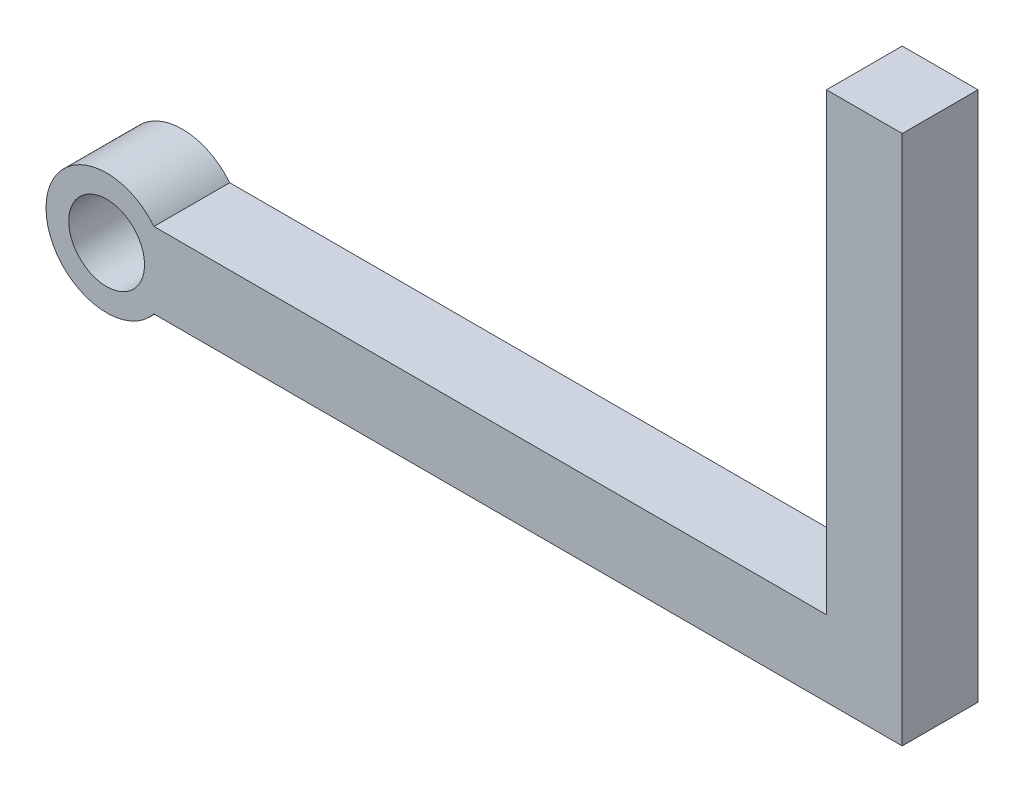
ISO-10303-21;
HEADER;
FILE_DESCRIPTION(('STEP AP214'),'2;1');
FILE_NAME('part.step','',(''),(''),'','','');
FILE_SCHEMA(('AUTOMOTIVE_DESIGN { 1 0 10303 214 1 1 1 1 }'));
ENDSEC;
DATA;
#1=APPLICATION_CONTEXT('core data for automotive mechanical design processes');
#2=APPLICATION_PROTOCOL_DEFINITION('international standard','automotive_design',2000,#1);
#3=PRODUCT_CONTEXT('',#1,'mechanical');
#4=PRODUCT('Part','Part','',(#3));
#5=PRODUCT_RELATED_PRODUCT_CATEGORY('part','',(#4));
#6=PRODUCT_DEFINITION_FORMATION('','',#4);
#7=PRODUCT_DEFINITION_CONTEXT('part definition',#1,'design');
#8=PRODUCT_DEFINITION('design','',#6,#7);
#9=PRODUCT_DEFINITION_SHAPE('','',#8);
#10=(LENGTH_UNIT() NAMED_UNIT(*) SI_UNIT(.MILLI.,.METRE.));
#11=(NAMED_UNIT(*) PLANE_ANGLE_UNIT() SI_UNIT($,.RADIAN.));
#12=(NAMED_UNIT(*) SI_UNIT($,.STERADIAN.) SOLID_ANGLE_UNIT());
#13=UNCERTAINTY_MEASURE_WITH_UNIT(LENGTH_MEASURE(1.E-05),#10,'distance_accuracy_value','');
#14=(GEOMETRIC_REPRESENTATION_CONTEXT(3) GLOBAL_UNCERTAINTY_ASSIGNED_CONTEXT((#13)) GLOBAL_UNIT_ASSIGNED_CONTEXT((#10,
#11,#12)) REPRESENTATION_CONTEXT('',''));
#15=CARTESIAN_POINT('',(0.,0.,0.));
#16=DIRECTION('',(0.,0.,1.));
#17=DIRECTION('',(1.,0.,0.));
#18=AXIS2_PLACEMENT_3D('',#15,#16,#17);
#19=CARTESIAN_POINT('',(0.,12.7,-31.75));
#20=DIRECTION('',(0.,0.,-1.));
#21=DIRECTION('',(-1.,0.,0.));
#22=AXIS2_PLACEMENT_3D('',#19,#20,#21);
#23=PLANE('',#22);
#24=CARTESIAN_POINT('',(-69.85,6.35,-31.75));
#25=DIRECTION('',(0.,0.,-1.));
#26=DIRECTION('',(-1.,0.,0.));
#27=AXIS2_PLACEMENT_3D('',#24,#25,#26);
#28=CIRCLE('',#27,6.34999999999999);
#29=CARTESIAN_POINT('',(-76.2,6.35,-31.75));
#30=VERTEX_POINT('',#29);
#31=EDGE_CURVE('E103',#30,#30,#28,.T.);
#32=ORIENTED_EDGE('',*,*,#31,.T.);
#33=EDGE_LOOP('',(#32));
#34=FACE_BOUND('',#33,.T.);
#35=DIRECTION('',(1.,0.,0.));
#36=VECTOR('',#35,1.);
#37=CARTESIAN_POINT('',(0.,12.7,-31.75));
#38=LINE('',#37,#36);
#39=CARTESIAN_POINT('',(-61.918852542034,12.7,-31.75));
#40=VERTEX_POINT('',#39);
#41=CARTESIAN_POINT('',(50.8,12.7,-31.75));
#42=VERTEX_POINT('',#41);
#43=EDGE_CURVE('E92',#40,#42,#38,.T.);
#44=ORIENTED_EDGE('',*,*,#43,.F.);
#45=CARTESIAN_POINT('',(-69.85,6.35,-31.75));
#46=DIRECTION('',(0.,0.,-1.));
#47=DIRECTION('',(-1.,0.,0.));
#48=AXIS2_PLACEMENT_3D('',#45,#46,#47);
#49=CIRCLE('',#48,10.16);
#50=CARTESIAN_POINT('',(-61.918852542034,0.,-31.75));
#51=VERTEX_POINT('',#50);
#52=EDGE_CURVE('E102',#51,#40,#49,.T.);
#53=ORIENTED_EDGE('',*,*,#52,.F.);
#54=DIRECTION('',(1.,0.,0.));
#55=VECTOR('',#54,1.);
#56=CARTESIAN_POINT('',(0.,0.,-31.75));
#57=LINE('',#56,#55);
#58=CARTESIAN_POINT('',(63.5,0.,-31.75));
#59=VERTEX_POINT('',#58);
#60=EDGE_CURVE('E97',#51,#59,#57,.T.);
#61=ORIENTED_EDGE('',*,*,#60,.T.);
#62=DIRECTION('',(0.,-1.,0.));
#63=VECTOR('',#62,1.);
#64=CARTESIAN_POINT('',(63.5,12.7,-31.75));
#65=LINE('',#64,#63);
#66=CARTESIAN_POINT('',(63.5,88.9,-31.75));
#67=VERTEX_POINT('',#66);
#68=EDGE_CURVE('E40',#67,#59,#65,.T.);
#69=ORIENTED_EDGE('',*,*,#68,.F.);
#70=DIRECTION('',(1.,0.,0.));
#71=VECTOR('',#70,1.);
#72=CARTESIAN_POINT('',(50.8,88.9,-31.75));
#73=LINE('',#72,#71);
#74=CARTESIAN_POINT('',(50.8,88.9,-31.75));
#75=VERTEX_POINT('',#74);
#76=EDGE_CURVE('E119',#75,#67,#73,.T.);
#77=ORIENTED_EDGE('',*,*,#76,.F.);
#78=DIRECTION('',(0.,-1.,0.));
#79=VECTOR('',#78,1.);
#80=CARTESIAN_POINT('',(50.8,88.9,-31.75));
#81=LINE('',#80,#79);
#82=EDGE_CURVE('E122',#75,#42,#81,.T.);
#83=ORIENTED_EDGE('',*,*,#82,.T.);
#84=EDGE_LOOP('',(#44,#53,#61,#69,#77,#83));
#85=FACE_BOUND('',#84,.T.);
#86=ADVANCED_FACE('F33',(#34,#85),#23,.F.);
#87=CARTESIAN_POINT('',(63.5,12.7,0.));
#88=DIRECTION('',(-1.,0.,0.));
#89=DIRECTION('',(0.,0.,1.));
#90=AXIS2_PLACEMENT_3D('',#87,#88,#89);
#91=PLANE('',#90);
#92=DIRECTION('',(0.,0.,-1.));
#93=VECTOR('',#92,1.);
#94=CARTESIAN_POINT('',(63.5,0.,0.));
#95=LINE('',#94,#93);
#96=CARTESIAN_POINT('',(63.5,0.,-44.45));
#97=VERTEX_POINT('',#96);
#98=EDGE_CURVE('E93',#59,#97,#95,.T.);
#99=ORIENTED_EDGE('',*,*,#98,.T.);
#100=DIRECTION('',(0.,-1.,0.));
#101=VECTOR('',#100,1.);
#102=CARTESIAN_POINT('',(63.5,12.7,-44.45));
#103=LINE('',#102,#101);
#104=CARTESIAN_POINT('',(63.5,88.9,-44.45));
#105=VERTEX_POINT('',#104);
#106=EDGE_CURVE('E88',#105,#97,#103,.T.);
#107=ORIENTED_EDGE('',*,*,#106,.F.);
#108=DIRECTION('',(0.,0.,-1.));
#109=VECTOR('',#108,1.);
#110=CARTESIAN_POINT('',(63.5,88.9,-31.75));
#111=LINE('',#110,#109);
#112=EDGE_CURVE('E112',#67,#105,#111,.T.);
#113=ORIENTED_EDGE('',*,*,#112,.F.);
#114=ORIENTED_EDGE('',*,*,#68,.T.);
#115=EDGE_LOOP('',(#99,#107,#113,#114));
#116=FACE_BOUND('',#115,.T.);
#117=ADVANCED_FACE('F137',(#116),#91,.F.);
#118=CARTESIAN_POINT('',(0.,12.7,-44.45));
#119=DIRECTION('',(0.,0.,-1.));
#120=DIRECTION('',(-1.,0.,0.));
#121=AXIS2_PLACEMENT_3D('',#118,#119,#120);
#122=PLANE('',#121);
#123=CARTESIAN_POINT('',(-69.85,6.35,-44.45));
#124=DIRECTION('',(0.,0.,-1.));
#125=DIRECTION('',(-1.,0.,0.));
#126=AXIS2_PLACEMENT_3D('',#123,#124,#125);
#127=CIRCLE('',#126,6.34999999999999);
#128=CARTESIAN_POINT('',(-76.2,6.35,-44.45));
#129=VERTEX_POINT('',#128);
#130=EDGE_CURVE('E107',#129,#129,#127,.T.);
#131=ORIENTED_EDGE('',*,*,#130,.F.);
#132=EDGE_LOOP('',(#131));
#133=FACE_BOUND('',#132,.T.);
#134=DIRECTION('',(1.,0.,0.));
#135=VECTOR('',#134,1.);
#136=CARTESIAN_POINT('',(0.,0.,-44.45));
#137=LINE('',#136,#135);
#138=CARTESIAN_POINT('',(-61.918852542034,0.,-44.45));
#139=VERTEX_POINT('',#138);
#140=EDGE_CURVE('E83',#139,#97,#137,.T.);
#141=ORIENTED_EDGE('',*,*,#140,.F.);
#142=CARTESIAN_POINT('',(-69.85,6.35,-44.45));
#143=DIRECTION('',(0.,0.,-1.));
#144=DIRECTION('',(-1.,0.,0.));
#145=AXIS2_PLACEMENT_3D('',#142,#143,#144);
#146=CIRCLE('',#145,10.16);
#147=CARTESIAN_POINT('',(-61.918852542034,12.7,-44.45));
#148=VERTEX_POINT('',#147);
#149=EDGE_CURVE('E86',#139,#148,#146,.T.);
#150=ORIENTED_EDGE('',*,*,#149,.T.);
#151=DIRECTION('',(1.,0.,0.));
#152=VECTOR('',#151,1.);
#153=CARTESIAN_POINT('',(0.,12.7,-44.45));
#154=LINE('',#153,#152);
#155=CARTESIAN_POINT('',(50.8,12.7,-44.45));
#156=VERTEX_POINT('',#155);
#157=EDGE_CURVE('E52',#148,#156,#154,.T.);
#158=ORIENTED_EDGE('',*,*,#157,.T.);
#159=DIRECTION('',(0.,-1.,0.));
#160=VECTOR('',#159,1.);
#161=CARTESIAN_POINT('',(50.8,88.9,-44.45));
#162=LINE('',#161,#160);
#163=CARTESIAN_POINT('',(50.8,88.9,-44.45));
#164=VERTEX_POINT('',#163);
#165=EDGE_CURVE('E127',#164,#156,#162,.T.);
#166=ORIENTED_EDGE('',*,*,#165,.F.);
#167=DIRECTION('',(-1.,0.,0.));
#168=VECTOR('',#167,1.);
#169=CARTESIAN_POINT('',(50.8,88.9,-44.45));
#170=LINE('',#169,#168);
#171=EDGE_CURVE('E115',#105,#164,#170,.T.);
#172=ORIENTED_EDGE('',*,*,#171,.F.);
#173=ORIENTED_EDGE('',*,*,#106,.T.);
#174=EDGE_LOOP('',(#141,#150,#158,#166,#172,#173));
#175=FACE_BOUND('',#174,.T.);
#176=ADVANCED_FACE('F84',(#133,#175),#122,.T.);
#177=CARTESIAN_POINT('',(0.,12.7,0.));
#178=DIRECTION('',(0.,1.,0.));
#179=DIRECTION('',(0.,0.,1.));
#180=AXIS2_PLACEMENT_3D('',#177,#178,#179);
#181=PLANE('',#180);
#182=DIRECTION('',(0.,0.,-1.));
#183=VECTOR('',#182,1.);
#184=CARTESIAN_POINT('',(-61.918852542034,12.7,-31.75));
#185=LINE('',#184,#183);
#186=EDGE_CURVE('E47',#40,#148,#185,.T.);
#187=ORIENTED_EDGE('',*,*,#186,.F.);
#188=ORIENTED_EDGE('',*,*,#43,.T.);
#189=DIRECTION('',(0.,0.,1.));
#190=VECTOR('',#189,1.);
#191=CARTESIAN_POINT('',(50.8,12.7,-31.75));
#192=LINE('',#191,#190);
#193=EDGE_CURVE('E111',#156,#42,#192,.T.);
#194=ORIENTED_EDGE('',*,*,#193,.F.);
#195=ORIENTED_EDGE('',*,*,#157,.F.);
#196=EDGE_LOOP('',(#187,#188,#194,#195));
#197=FACE_BOUND('',#196,.T.);
#198=ADVANCED_FACE('F147',(#197),#181,.T.);
#199=CARTESIAN_POINT('',(0.,0.,0.));
#200=DIRECTION('',(0.,1.,0.));
#201=DIRECTION('',(0.,0.,1.));
#202=AXIS2_PLACEMENT_3D('',#199,#200,#201);
#203=PLANE('',#202);
#204=ORIENTED_EDGE('',*,*,#60,.F.);
#205=DIRECTION('',(0.,0.,-1.));
#206=VECTOR('',#205,1.);
#207=CARTESIAN_POINT('',(-61.918852542034,0.,-31.75));
#208=LINE('',#207,#206);
#209=EDGE_CURVE('E11',#51,#139,#208,.T.);
#210=ORIENTED_EDGE('',*,*,#209,.T.);
#211=ORIENTED_EDGE('',*,*,#140,.T.);
#212=ORIENTED_EDGE('',*,*,#98,.F.);
#213=EDGE_LOOP('',(#204,#210,#211,#212));
#214=FACE_BOUND('',#213,.T.);
#215=ADVANCED_FACE('F96',(#214),#203,.F.);
#216=CARTESIAN_POINT('',(50.8,88.9,-31.75));
#217=DIRECTION('',(1.,0.,0.));
#218=DIRECTION('',(0.,0.,-1.));
#219=AXIS2_PLACEMENT_3D('',#216,#217,#218);
#220=PLANE('',#219);
#221=ORIENTED_EDGE('',*,*,#193,.T.);
#222=ORIENTED_EDGE('',*,*,#82,.F.);
#223=DIRECTION('',(0.,0.,1.));
#224=VECTOR('',#223,1.);
#225=CARTESIAN_POINT('',(50.8,88.9,-31.75));
#226=LINE('',#225,#224);
#227=EDGE_CURVE('E117',#164,#75,#226,.T.);
#228=ORIENTED_EDGE('',*,*,#227,.F.);
#229=ORIENTED_EDGE('',*,*,#165,.T.);
#230=EDGE_LOOP('',(#221,#222,#228,#229));
#231=FACE_BOUND('',#230,.T.);
#232=ADVANCED_FACE('F146',(#231),#220,.F.);
#233=CARTESIAN_POINT('',(0.,88.9,0.));
#234=DIRECTION('',(0.,-1.,0.));
#235=DIRECTION('',(0.,0.,-1.));
#236=AXIS2_PLACEMENT_3D('',#233,#234,#235);
#237=PLANE('',#236);
#238=ORIENTED_EDGE('',*,*,#112,.T.);
#239=ORIENTED_EDGE('',*,*,#171,.T.);
#240=ORIENTED_EDGE('',*,*,#227,.T.);
#241=ORIENTED_EDGE('',*,*,#76,.T.);
#242=EDGE_LOOP('',(#238,#239,#240,#241));
#243=FACE_BOUND('',#242,.T.);
#244=ADVANCED_FACE('F141',(#243),#237,.F.);
#245=CARTESIAN_POINT('',(-69.85,6.35,-31.75));
#246=DIRECTION('',(0.,0.,-1.));
#247=DIRECTION('',(-1.,0.,0.));
#248=AXIS2_PLACEMENT_3D('',#245,#246,#247);
#249=CYLINDRICAL_SURFACE('',#248,10.16);
#250=ORIENTED_EDGE('',*,*,#52,.T.);
#251=ORIENTED_EDGE('',*,*,#186,.T.);
#252=ORIENTED_EDGE('',*,*,#149,.F.);
#253=ORIENTED_EDGE('',*,*,#209,.F.);
#254=EDGE_LOOP('',(#250,#251,#252,#253));
#255=FACE_BOUND('',#254,.T.);
#256=ADVANCED_FACE('F101',(#255),#249,.T.);
#257=CARTESIAN_POINT('',(-69.85,6.35,-44.45));
#258=DIRECTION('',(0.,0.,-1.));
#259=DIRECTION('',(-1.,0.,0.));
#260=AXIS2_PLACEMENT_3D('',#257,#258,#259);
#261=CYLINDRICAL_SURFACE('',#260,6.34999999999999);
#262=ORIENTED_EDGE('',*,*,#31,.F.);
#263=EDGE_LOOP('',(#262));
#264=FACE_BOUND('',#263,.T.);
#265=ORIENTED_EDGE('',*,*,#130,.T.);
#266=EDGE_LOOP('',(#265));
#267=FACE_BOUND('',#266,.T.);
#268=ADVANCED_FACE('F165',(#264,#267),#261,.F.);
#269=CLOSED_SHELL('',(#86,#117,#176,#198,#215,#232,#244,#256,#268));
#270=MANIFOLD_SOLID_BREP('B2',#269);
#271=ADVANCED_BREP_SHAPE_REPRESENTATION('',(#18,#270),#14);
#272=SHAPE_DEFINITION_REPRESENTATION(#9,#271);
ENDSEC;
END-ISO-10303-21;
